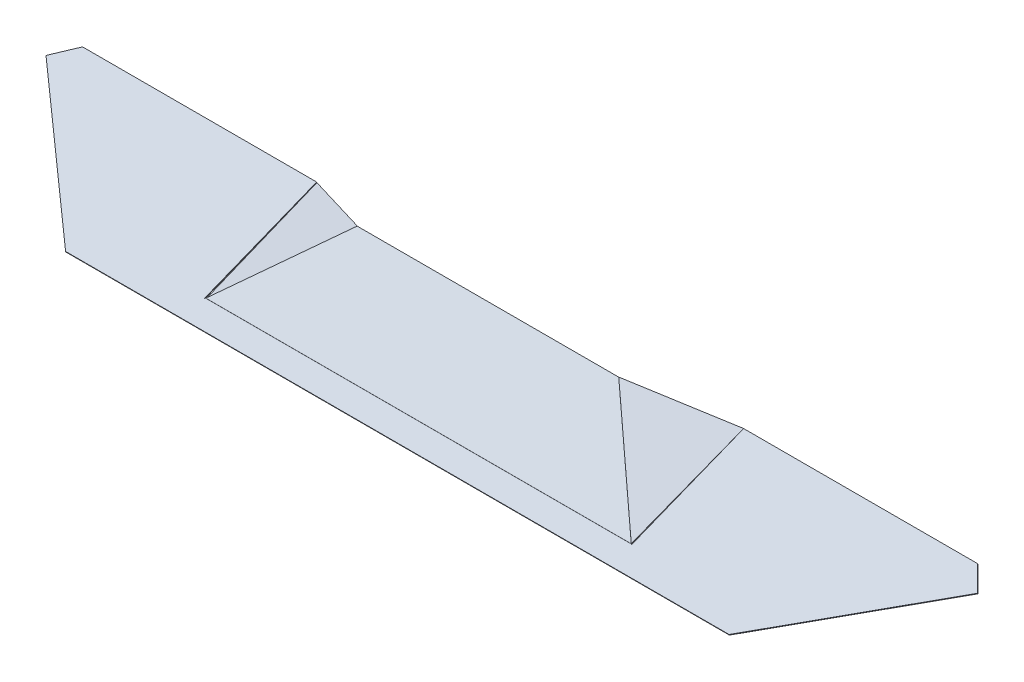
ISO-10303-21;
HEADER;
FILE_DESCRIPTION(('STEP AP214'),'2;1');
FILE_NAME('part.step','',(''),(''),'','','');
FILE_SCHEMA(('AUTOMOTIVE_DESIGN { 1 0 10303 214 1 1 1 1 }'));
ENDSEC;
DATA;
#1=APPLICATION_CONTEXT('core data for automotive mechanical design processes');
#2=APPLICATION_PROTOCOL_DEFINITION('international standard','automotive_design',2000,#1);
#3=PRODUCT_CONTEXT('',#1,'mechanical');
#4=PRODUCT('Part','Part','',(#3));
#5=PRODUCT_RELATED_PRODUCT_CATEGORY('part','',(#4));
#6=PRODUCT_DEFINITION_FORMATION('','',#4);
#7=PRODUCT_DEFINITION_CONTEXT('part definition',#1,'design');
#8=PRODUCT_DEFINITION('design','',#6,#7);
#9=PRODUCT_DEFINITION_SHAPE('','',#8);
#10=(LENGTH_UNIT() NAMED_UNIT(*) SI_UNIT(.MILLI.,.METRE.));
#11=(NAMED_UNIT(*) PLANE_ANGLE_UNIT() SI_UNIT($,.RADIAN.));
#12=(NAMED_UNIT(*) SI_UNIT($,.STERADIAN.) SOLID_ANGLE_UNIT());
#13=UNCERTAINTY_MEASURE_WITH_UNIT(LENGTH_MEASURE(1.E-05),#10,'distance_accuracy_value','');
#14=(GEOMETRIC_REPRESENTATION_CONTEXT(3) GLOBAL_UNCERTAINTY_ASSIGNED_CONTEXT((#13)) GLOBAL_UNIT_ASSIGNED_CONTEXT((#10,
#11,#12)) REPRESENTATION_CONTEXT('',''));
#15=CARTESIAN_POINT('',(0.,0.,0.));
#16=DIRECTION('',(0.,0.,1.));
#17=DIRECTION('',(1.,0.,0.));
#18=AXIS2_PLACEMENT_3D('',#15,#16,#17);
#19=CARTESIAN_POINT('',(288.887807011262,234.001150955132,848.716663011759));
#20=DIRECTION('',(0.285010061459043,-0.475706194203848,0.832149554865712));
#21=DIRECTION('',(0.,-0.868156769319889,-0.496290060230962));
#22=AXIS2_PLACEMENT_3D('',#19,#20,#21);
#23=PLANE('',#22);
#24=DIRECTION('',(-0.861519930817182,0.253434956762582,0.439947873611757));
#25=VECTOR('',#24,1.);
#26=CARTESIAN_POINT('',(288.467625296201,233.158847957698,848.379064156842));
#27=LINE('',#26,#25);
#28=CARTESIAN_POINT('',(288.467625296201,233.158847957698,848.379064156842));
#29=VERTEX_POINT('',#28);
#30=CARTESIAN_POINT('',(176.61181804443,266.063683540094,905.499883758619));
#31=VERTEX_POINT('',#30);
#32=EDGE_CURVE('E125',#29,#31,#27,.T.);
#33=ORIENTED_EDGE('',*,*,#32,.T.);
#34=DIRECTION('',(-0.420181715061318,-0.842302997434319,-0.337598854917031));
#35=VECTOR('',#34,1.);
#36=CARTESIAN_POINT('',(177.031999759491,266.905986537528,905.837482613536));
#37=LINE('',#36,#35);
#38=CARTESIAN_POINT('',(177.031999759491,266.905986537528,905.837482613536));
#39=VERTEX_POINT('',#38);
#40=EDGE_CURVE('E13',#39,#31,#37,.T.);
#41=ORIENTED_EDGE('',*,*,#40,.F.);
#42=DIRECTION('',(-0.861519930817182,0.253434956762582,0.439947873611757));
#43=VECTOR('',#42,1.);
#44=CARTESIAN_POINT('',(288.887807011262,234.001150955132,848.716663011759));
#45=LINE('',#44,#43);
#46=CARTESIAN_POINT('',(288.887807011262,234.001150955132,848.716663011759));
#47=VERTEX_POINT('',#46);
#48=EDGE_CURVE('E118',#47,#39,#45,.T.);
#49=ORIENTED_EDGE('',*,*,#48,.F.);
#50=DIRECTION('',(-0.420181715061318,-0.842302997434319,-0.337598854917031));
#51=VECTOR('',#50,1.);
#52=CARTESIAN_POINT('',(288.887807011262,234.001150955132,848.716663011759));
#53=LINE('',#52,#51);
#54=EDGE_CURVE('E126',#47,#29,#53,.T.);
#55=ORIENTED_EDGE('',*,*,#54,.T.);
#56=EDGE_LOOP('',(#33,#41,#49,#55));
#57=FACE_BOUND('',#56,.T.);
#58=ADVANCED_FACE('F78',(#57),#23,.F.);
#59=CARTESIAN_POINT('',(177.031999759491,266.905986537528,905.837482613536));
#60=DIRECTION('',(0.640524328313609,-0.0117678602008179,-0.767847707755056));
#61=DIRECTION('',(-0.767900880025728,0.,-0.640568683636433));
#62=AXIS2_PLACEMENT_3D('',#59,#60,#61);
#63=PLANE('',#62);
#64=DIRECTION('',(0.642787609686535,-0.538875846535596,0.544460201349938));
#65=VECTOR('',#64,1.);
#66=CARTESIAN_POINT('',(176.61181804443,266.063683540094,905.499883758619));
#67=LINE('',#66,#65);
#68=CARTESIAN_POINT('',(287.366006523577,173.213796307251,999.311971687806));
#69=VERTEX_POINT('',#68);
#70=EDGE_CURVE('E106',#31,#69,#67,.T.);
#71=ORIENTED_EDGE('',*,*,#70,.T.);
#72=DIRECTION('',(-0.420181715061318,-0.842302997434319,-0.337598854917031));
#73=VECTOR('',#72,1.);
#74=CARTESIAN_POINT('',(287.786188238638,174.056099304685,999.649570542723));
#75=LINE('',#74,#73);
#76=CARTESIAN_POINT('',(287.786188238638,174.056099304685,999.649570542723));
#77=VERTEX_POINT('',#76);
#78=EDGE_CURVE('E86',#77,#69,#75,.T.);
#79=ORIENTED_EDGE('',*,*,#78,.F.);
#80=DIRECTION('',(0.642787609686535,-0.538875846535596,0.544460201349938));
#81=VECTOR('',#80,1.);
#82=CARTESIAN_POINT('',(177.031999759491,266.905986537528,905.837482613536));
#83=LINE('',#82,#81);
#84=EDGE_CURVE('E114',#39,#77,#83,.T.);
#85=ORIENTED_EDGE('',*,*,#84,.F.);
#86=ORIENTED_EDGE('',*,*,#40,.T.);
#87=EDGE_LOOP('',(#71,#79,#85,#86));
#88=FACE_BOUND('',#87,.T.);
#89=ADVANCED_FACE('F115',(#88),#63,.F.);
#90=CARTESIAN_POINT('',(287.786188238638,174.056099304685,999.649570542723));
#91=DIRECTION('',(-0.907414632383294,0.392790713074043,0.149379184157221));
#92=DIRECTION('',(-0.397247839672572,-0.917711367411058,0.));
#93=AXIS2_PLACEMENT_3D('',#90,#91,#92);
#94=PLANE('',#93);
#95=DIRECTION('',(0.00678316038592086,0.3691085426212,-0.929361540251819));
#96=VECTOR('',#95,1.);
#97=CARTESIAN_POINT('',(287.366006523577,173.213796307251,999.311971687806));
#98=LINE('',#97,#96);
#99=EDGE_CURVE('E111',#69,#29,#98,.T.);
#100=ORIENTED_EDGE('',*,*,#99,.T.);
#101=ORIENTED_EDGE('',*,*,#54,.F.);
#102=DIRECTION('',(0.00678316038592086,0.3691085426212,-0.929361540251819));
#103=VECTOR('',#102,1.);
#104=CARTESIAN_POINT('',(287.786188238638,174.056099304685,999.649570542723));
#105=LINE('',#104,#103);
#106=EDGE_CURVE('E94',#77,#47,#105,.T.);
#107=ORIENTED_EDGE('',*,*,#106,.F.);
#108=ORIENTED_EDGE('',*,*,#78,.T.);
#109=EDGE_LOOP('',(#100,#101,#107,#108));
#110=FACE_BOUND('',#109,.T.);
#111=ADVANCED_FACE('F133',(#110),#94,.F.);
#112=CARTESIAN_POINT('',(254.214567445107,509.602594485186,204.251027106623));
#113=DIRECTION('',(-0.420181715061318,-0.842302997434319,-0.337598854917031));
#114=DIRECTION('',(0.894838919549624,-0.446389189003565,0.));
#115=AXIS2_PLACEMENT_3D('',#112,#113,#114);
#116=PLANE('',#115);
#117=ORIENTED_EDGE('',*,*,#48,.T.);
#118=ORIENTED_EDGE('',*,*,#84,.T.);
#119=ORIENTED_EDGE('',*,*,#106,.T.);
#120=EDGE_LOOP('',(#117,#118,#119));
#121=FACE_BOUND('',#120,.T.);
#122=ADVANCED_FACE('F121',(#121),#116,.F.);
#123=CARTESIAN_POINT('',(253.794385730046,508.760291487751,203.913428251706));
#124=DIRECTION('',(-0.420181715061318,-0.842302997434319,-0.337598854917031));
#125=DIRECTION('',(0.894838919549624,-0.446389189003565,0.));
#126=AXIS2_PLACEMENT_3D('',#123,#124,#125);
#127=PLANE('',#126);
#128=ORIENTED_EDGE('',*,*,#32,.F.);
#129=ORIENTED_EDGE('',*,*,#99,.F.);
#130=ORIENTED_EDGE('',*,*,#70,.F.);
#131=EDGE_LOOP('',(#128,#129,#130));
#132=FACE_BOUND('',#131,.T.);
#133=ADVANCED_FACE('F134',(#132),#127,.T.);
#134=CLOSED_SHELL('',(#58,#89,#111,#122,#133));
#135=MANIFOLD_SOLID_BREP('B2',#134);
#136=CARTESIAN_POINT('',(-288.428732188603,232.151779687274,847.977992877797));
#137=DIRECTION('',(0.907413105657838,0.392872566416373,0.149173061367698));
#138=DIRECTION('',(-0.397318117843622,0.917680943047856,0.));
#139=AXIS2_PLACEMENT_3D('',#136,#137,#138);
#140=PLANE('',#139);
#141=DIRECTION('',(-0.00698441182401754,0.36902141817322,-0.929394647564154));
#142=VECTOR('',#141,1.);
#143=CARTESIAN_POINT('',(-288.848913903664,232.994082684708,848.315591732714));
#144=LINE('',#143,#142);
#145=CARTESIAN_POINT('',(-287.717339417154,173.207341538567,998.890800867172));
#146=VERTEX_POINT('',#145);
#147=CARTESIAN_POINT('',(-288.848913903664,232.994082684708,848.315591732714));
#148=VERTEX_POINT('',#147);
#149=EDGE_CURVE('E232',#146,#148,#144,.T.);
#150=ORIENTED_EDGE('',*,*,#149,.T.);
#151=DIRECTION('',(-0.420181715061318,0.842302997434319,0.337598854917032));
#152=VECTOR('',#151,1.);
#153=CARTESIAN_POINT('',(-288.428732188603,232.151779687274,847.977992877797));
#154=LINE('',#153,#152);
#155=CARTESIAN_POINT('',(-288.428732188603,232.151779687274,847.977992877797));
#156=VERTEX_POINT('',#155);
#157=EDGE_CURVE('E76',#156,#148,#154,.T.);
#158=ORIENTED_EDGE('',*,*,#157,.F.);
#159=DIRECTION('',(-0.00698441182401754,0.36902141817322,-0.929394647564154));
#160=VECTOR('',#159,1.);
#161=CARTESIAN_POINT('',(-288.428732188603,232.151779687274,847.977992877797));
#162=LINE('',#161,#160);
#163=CARTESIAN_POINT('',(-287.297157702093,172.365038541133,998.553202012255));
#164=VERTEX_POINT('',#163);
#165=EDGE_CURVE('E225',#164,#156,#162,.T.);
#166=ORIENTED_EDGE('',*,*,#165,.F.);
#167=DIRECTION('',(-0.420181715061318,0.842302997434319,0.337598854917032));
#168=VECTOR('',#167,1.);
#169=CARTESIAN_POINT('',(-287.297157702093,172.365038541133,998.553202012255));
#170=LINE('',#169,#168);
#171=EDGE_CURVE('E233',#164,#146,#170,.T.);
#172=ORIENTED_EDGE('',*,*,#171,.T.);
#173=EDGE_LOOP('',(#150,#158,#166,#172));
#174=FACE_BOUND('',#173,.T.);
#175=ADVANCED_FACE('F185',(#174),#140,.F.);
#176=CARTESIAN_POINT('',(-288.428732188603,232.151779687274,847.977992877797));
#177=DIRECTION('',(-0.282475585171227,-0.474958928428571,0.833439595944515));
#178=DIRECTION('',(0.,-0.86882285119073,-0.49512306879079));
#179=AXIS2_PLACEMENT_3D('',#176,#177,#178);
#180=PLANE('',#179);
#181=DIRECTION('',(0.862354260214619,0.254832644728153,0.43749908922254));
#182=VECTOR('',#181,1.);
#183=CARTESIAN_POINT('',(-288.848913903664,232.994082684708,848.315591732714));
#184=LINE('',#183,#182);
#185=CARTESIAN_POINT('',(-176.963150938007,266.05722877141,905.078712937985));
#186=VERTEX_POINT('',#185);
#187=EDGE_CURVE('E213',#148,#186,#184,.T.);
#188=ORIENTED_EDGE('',*,*,#187,.T.);
#189=DIRECTION('',(-0.420181715061318,0.842302997434319,0.337598854917032));
#190=VECTOR('',#189,1.);
#191=CARTESIAN_POINT('',(-176.542969222945,265.214925773976,904.741114083068));
#192=LINE('',#191,#190);
#193=CARTESIAN_POINT('',(-176.542969222945,265.214925773976,904.741114083068));
#194=VERTEX_POINT('',#193);
#195=EDGE_CURVE('E193',#194,#186,#192,.T.);
#196=ORIENTED_EDGE('',*,*,#195,.F.);
#197=DIRECTION('',(0.862354260214619,0.254832644728153,0.43749908922254));
#198=VECTOR('',#197,1.);
#199=CARTESIAN_POINT('',(-288.428732188603,232.151779687274,847.977992877797));
#200=LINE('',#199,#198);
#201=EDGE_CURVE('E221',#156,#194,#200,.T.);
#202=ORIENTED_EDGE('',*,*,#201,.F.);
#203=ORIENTED_EDGE('',*,*,#157,.T.);
#204=EDGE_LOOP('',(#188,#196,#202,#203));
#205=FACE_BOUND('',#204,.T.);
#206=ADVANCED_FACE('F222',(#205),#180,.F.);
#207=CARTESIAN_POINT('',(-176.542969222945,265.214925773976,904.741114083068));
#208=DIRECTION('',(-0.640524328313609,-0.0117678602008171,-0.767847707755057));
#209=DIRECTION('',(-0.767900880025728,0.,0.640568683636433));
#210=AXIS2_PLACEMENT_3D('',#207,#208,#209);
#211=PLANE('',#210);
#212=DIRECTION('',(-0.642787609686535,-0.538875846535596,0.544460201349938));
#213=VECTOR('',#212,1.);
#214=CARTESIAN_POINT('',(-176.963150938007,266.05722877141,905.078712937985));
#215=LINE('',#214,#213);
#216=EDGE_CURVE('E218',#186,#146,#215,.T.);
#217=ORIENTED_EDGE('',*,*,#216,.T.);
#218=ORIENTED_EDGE('',*,*,#171,.F.);
#219=DIRECTION('',(-0.642787609686535,-0.538875846535596,0.544460201349938));
#220=VECTOR('',#219,1.);
#221=CARTESIAN_POINT('',(-176.542969222945,265.214925773976,904.741114083068));
#222=LINE('',#221,#220);
#223=EDGE_CURVE('E201',#194,#164,#222,.T.);
#224=ORIENTED_EDGE('',*,*,#223,.F.);
#225=ORIENTED_EDGE('',*,*,#195,.T.);
#226=EDGE_LOOP('',(#217,#218,#224,#225));
#227=FACE_BOUND('',#226,.T.);
#228=ADVANCED_FACE('F240',(#227),#211,.F.);
#229=CARTESIAN_POINT('',(-253.374204014985,507.917988490318,203.57582939679));
#230=DIRECTION('',(-0.420181715061318,0.842302997434319,0.337598854917032));
#231=DIRECTION('',(-0.894838919549625,-0.446389189003565,0.));
#232=AXIS2_PLACEMENT_3D('',#229,#230,#231);
#233=PLANE('',#232);
#234=ORIENTED_EDGE('',*,*,#165,.T.);
#235=ORIENTED_EDGE('',*,*,#201,.T.);
#236=ORIENTED_EDGE('',*,*,#223,.T.);
#237=EDGE_LOOP('',(#234,#235,#236));
#238=FACE_BOUND('',#237,.T.);
#239=ADVANCED_FACE('F228',(#238),#233,.F.);
#240=CARTESIAN_POINT('',(-253.794385730046,508.760291487752,203.913428251707));
#241=DIRECTION('',(-0.420181715061318,0.842302997434319,0.337598854917032));
#242=DIRECTION('',(-0.894838919549625,-0.446389189003565,0.));
#243=AXIS2_PLACEMENT_3D('',#240,#241,#242);
#244=PLANE('',#243);
#245=ORIENTED_EDGE('',*,*,#149,.F.);
#246=ORIENTED_EDGE('',*,*,#216,.F.);
#247=ORIENTED_EDGE('',*,*,#187,.F.);
#248=EDGE_LOOP('',(#245,#246,#247));
#249=FACE_BOUND('',#248,.T.);
#250=ADVANCED_FACE('F241',(#249),#244,.T.);
#251=CLOSED_SHELL('',(#175,#206,#228,#239,#250));
#252=MANIFOLD_SOLID_BREP('B7',#251);
#253=CARTESIAN_POINT('',(-288.848913903664,172.587219436625,1000.07543952209));
#254=DIRECTION('',(-0.766044443118982,0.237717163190301,-0.597215590462342));
#255=DIRECTION('',(-0.512210129832261,0.335583401456135,0.790584950251615));
#256=AXIS2_PLACEMENT_3D('',#253,#254,#255);
#257=PLANE('',#256);
#258=DIRECTION('',(-0.642787609686534,-0.283300283253349,0.711733825486778));
#259=VECTOR('',#258,1.);
#260=CARTESIAN_POINT('',(-288.848913903664,173.51632196048,1000.44526177692));
#261=LINE('',#260,#259);
#262=CARTESIAN_POINT('',(-288.30228912782,173.757239724755,999.840005333024));
#263=VERTEX_POINT('',#262);
#264=CARTESIAN_POINT('',(-288.848913903664,173.51632196048,1000.44526177692));
#265=VERTEX_POINT('',#264);
#266=EDGE_CURVE('E310',#263,#265,#261,.T.);
#267=ORIENTED_EDGE('',*,*,#266,.F.);
#268=CARTESIAN_POINT('',(-288.30228912782,172.828137200901,999.470183078195));
#269=CARTESIAN_POINT('',(-288.30228912782,173.757239724755,999.840005333024));
#270=B_SPLINE_CURVE_WITH_KNOTS('',1,(#268,#269),.UNSPECIFIED.,.F.,.F.,(2,2),(0.,1.),.UNSPECIFIED.);
#271=CARTESIAN_POINT('',(-288.30228912782,172.828137200901,999.470183078195));
#272=VERTEX_POINT('',#271);
#273=EDGE_CURVE('E399',#263,#272,#270,.F.);
#274=ORIENTED_EDGE('',*,*,#273,.T.);
#275=DIRECTION('',(-0.642787609686534,-0.283300283253349,0.711733825486778));
#276=VECTOR('',#275,1.);
#277=CARTESIAN_POINT('',(-288.848913903664,172.587219436625,1000.07543952209));
#278=LINE('',#277,#276);
#279=CARTESIAN_POINT('',(-288.848913903664,172.587219436625,1000.07543952209));
#280=VERTEX_POINT('',#279);
#281=EDGE_CURVE('E401',#272,#280,#278,.T.);
#282=ORIENTED_EDGE('',*,*,#281,.T.);
#283=DIRECTION('',(0.,0.929102523854783,0.36982225482882));
#284=VECTOR('',#283,1.);
#285=CARTESIAN_POINT('',(-288.848913903664,172.587219436625,1000.07543952209));
#286=LINE('',#285,#284);
#287=EDGE_CURVE('E676',#280,#265,#286,.T.);
#288=ORIENTED_EDGE('',*,*,#287,.T.);
#289=EDGE_LOOP('',(#267,#274,#282,#288));
#290=FACE_BOUND('',#289,.T.);
#291=ADVANCED_FACE('F283',(#290),#257,.T.);
#292=CARTESIAN_POINT('',(288.848913903664,172.587219436625,1000.07543952209));
#293=DIRECTION('',(0.766044443118982,0.237717163190302,-0.597215590462343));
#294=DIRECTION('',(-0.512210129832261,-0.335583401456135,-0.790584950251615));
#295=AXIS2_PLACEMENT_3D('',#292,#293,#294);
#296=PLANE('',#295);
#297=DIRECTION('',(-0.642787609686535,0.283300283253349,-0.711733825486777));
#298=VECTOR('',#297,1.);
#299=CARTESIAN_POINT('',(288.848913903664,172.587219436625,1000.07543952209));
#300=LINE('',#299,#298);
#301=CARTESIAN_POINT('',(288.848913903664,172.587219436625,1000.07543952209));
#302=VERTEX_POINT('',#301);
#303=CARTESIAN_POINT('',(288.30228912782,172.8281372009,999.470183078195));
#304=VERTEX_POINT('',#303);
#305=EDGE_CURVE('E421',#302,#304,#300,.T.);
#306=ORIENTED_EDGE('',*,*,#305,.T.);
#307=CARTESIAN_POINT('',(288.30228912782,173.757239724755,999.840005333024));
#308=CARTESIAN_POINT('',(288.30228912782,172.8281372009,999.470183078195));
#309=B_SPLINE_CURVE_WITH_KNOTS('',1,(#307,#308),.UNSPECIFIED.,.F.,.F.,(2,2),(0.,1.),.UNSPECIFIED.);
#310=CARTESIAN_POINT('',(288.30228912782,173.757239724756,999.840005333024));
#311=VERTEX_POINT('',#310);
#312=EDGE_CURVE('E183',#304,#311,#309,.F.);
#313=ORIENTED_EDGE('',*,*,#312,.T.);
#314=DIRECTION('',(-0.642787609686535,0.283300283253349,-0.711733825486777));
#315=VECTOR('',#314,1.);
#316=CARTESIAN_POINT('',(288.848913903664,173.51632196048,1000.44526177692));
#317=LINE('',#316,#315);
#318=CARTESIAN_POINT('',(288.848913903664,173.51632196048,1000.44526177692));
#319=VERTEX_POINT('',#318);
#320=EDGE_CURVE('E303',#319,#311,#317,.T.);
#321=ORIENTED_EDGE('',*,*,#320,.F.);
#322=DIRECTION('',(0.,0.929102523854783,0.36982225482882));
#323=VECTOR('',#322,1.);
#324=CARTESIAN_POINT('',(288.848913903664,172.587219436625,1000.07543952209));
#325=LINE('',#324,#323);
#326=EDGE_CURVE('E679',#302,#319,#325,.T.);
#327=ORIENTED_EDGE('',*,*,#326,.F.);
#328=EDGE_LOOP('',(#306,#313,#321,#327));
#329=FACE_BOUND('',#328,.T.);
#330=ADVANCED_FACE('F285',(#329),#296,.T.);
#331=CARTESIAN_POINT('',(4.47895829043596E-13,391.511522191619,452.77705609597));
#332=DIRECTION('',(0.,0.929102523854783,0.369822254828819));
#333=DIRECTION('',(0.,-0.369822254828819,0.929102523854783));
#334=AXIS2_PLACEMENT_3D('',#331,#332,#333);
#335=PLANE('',#334);
#336=ORIENTED_EDGE('',*,*,#320,.T.);
#337=DIRECTION('',(-1.,0.,0.));
#338=VECTOR('',#337,1.);
#339=CARTESIAN_POINT('',(5.9871513001089E-13,173.757239724755,999.840005333024));
#340=LINE('',#339,#338);
#341=EDGE_CURVE('E296',#311,#263,#340,.T.);
#342=ORIENTED_EDGE('',*,*,#341,.T.);
#343=ORIENTED_EDGE('',*,*,#266,.T.);
#344=DIRECTION('',(0.,0.36982225482882,-0.929102523854783));
#345=VECTOR('',#344,1.);
#346=CARTESIAN_POINT('',(-288.848913903664,233.923185208563,848.685413987543));
#347=LINE('',#346,#345);
#348=CARTESIAN_POINT('',(-288.848913903664,233.923185208563,848.685413987543));
#349=VERTEX_POINT('',#348);
#350=EDGE_CURVE('E664',#265,#349,#347,.T.);
#351=ORIENTED_EDGE('',*,*,#350,.T.);
#352=DIRECTION('',(-1.,0.,0.));
#353=VECTOR('',#352,1.);
#354=CARTESIAN_POINT('',(-288.848913903664,233.923185208563,848.685413987543));
#355=LINE('',#354,#353);
#356=CARTESIAN_POINT('',(-605.56328041433,233.923185208563,848.685413987542));
#357=VERTEX_POINT('',#356);
#358=EDGE_CURVE('E607',#349,#357,#355,.T.);
#359=ORIENTED_EDGE('',*,*,#358,.T.);
#360=DIRECTION('',(-0.676587289763094,-0.272323216999984,0.684156199134241));
#361=VECTOR('',#360,1.);
#362=CARTESIAN_POINT('',(-605.56328041433,233.923185208563,848.685413987542));
#363=LINE('',#362,#361);
#364=CARTESIAN_POINT('',(-630.148809346447,224.027624899139,873.545978592283));
#365=VERTEX_POINT('',#364);
#366=EDGE_CURVE('E530',#357,#365,#363,.T.);
#367=ORIENTED_EDGE('',*,*,#366,.T.);
#368=DIRECTION('',(0.736362437479686,-0.250217037088709,0.628618958526963));
#369=VECTOR('',#368,1.);
#370=CARTESIAN_POINT('',(-630.148809346447,224.027624899139,873.545978592283));
#371=LINE('',#370,#369);
#372=CARTESIAN_POINT('',(-448.848913903664,162.421654315615,1028.31833749256));
#373=VERTEX_POINT('',#372);
#374=EDGE_CURVE('E641',#365,#373,#371,.T.);
#375=ORIENTED_EDGE('',*,*,#374,.T.);
#376=DIRECTION('',(1.,0.,0.));
#377=VECTOR('',#376,1.);
#378=CARTESIAN_POINT('',(-448.848913903664,162.421654315615,1028.31833749256));
#379=LINE('',#378,#377);
#380=CARTESIAN_POINT('',(448.848913903664,162.421654315615,1028.31833749256));
#381=VERTEX_POINT('',#380);
#382=EDGE_CURVE('E645',#373,#381,#379,.T.);
#383=ORIENTED_EDGE('',*,*,#382,.T.);
#384=DIRECTION('',(0.736362437479686,0.250217037088709,-0.628618958526963));
#385=VECTOR('',#384,1.);
#386=CARTESIAN_POINT('',(448.848913903664,162.421654315615,1028.31833749256));
#387=LINE('',#386,#385);
#388=CARTESIAN_POINT('',(630.148809346446,224.027624899139,873.545978592283));
#389=VERTEX_POINT('',#388);
#390=EDGE_CURVE('E649',#381,#389,#387,.T.);
#391=ORIENTED_EDGE('',*,*,#390,.T.);
#392=DIRECTION('',(-0.676587289763097,0.272323216999984,-0.684156199134238));
#393=VECTOR('',#392,1.);
#394=CARTESIAN_POINT('',(630.148809346446,224.027624899139,873.545978592283));
#395=LINE('',#394,#393);
#396=CARTESIAN_POINT('',(605.56328041433,233.923185208563,848.685413987542));
#397=VERTEX_POINT('',#396);
#398=EDGE_CURVE('E653',#389,#397,#395,.T.);
#399=ORIENTED_EDGE('',*,*,#398,.T.);
#400=DIRECTION('',(-1.,0.,0.));
#401=VECTOR('',#400,1.);
#402=CARTESIAN_POINT('',(605.56328041433,233.923185208563,848.685413987542));
#403=LINE('',#402,#401);
#404=CARTESIAN_POINT('',(288.848913903664,233.923185208563,848.685413987543));
#405=VERTEX_POINT('',#404);
#406=EDGE_CURVE('E657',#397,#405,#403,.T.);
#407=ORIENTED_EDGE('',*,*,#406,.T.);
#408=DIRECTION('',(0.,-0.36982225482882,0.929102523854783));
#409=VECTOR('',#408,1.);
#410=CARTESIAN_POINT('',(288.848913903664,233.923185208563,848.685413987543));
#411=LINE('',#410,#409);
#412=EDGE_CURVE('E661',#405,#319,#411,.T.);
#413=ORIENTED_EDGE('',*,*,#412,.T.);
#414=EDGE_LOOP('',(#336,#342,#343,#351,#359,#367,#375,#383,#391,#399,#407,#413));
#415=FACE_BOUND('',#414,.T.);
#416=ADVANCED_FACE('F728',(#415),#335,.T.);
#417=CARTESIAN_POINT('',(-605.56328041433,232.994082684708,848.315591732714));
#418=DIRECTION('',(-0.73636243747969,0.250217037088707,-0.628618958526958));
#419=DIRECTION('',(-0.546780501103968,0.327149792472144,0.77071661257425));
#420=AXIS2_PLACEMENT_3D('',#417,#418,#419);
#421=PLANE('',#420);
#422=ORIENTED_EDGE('',*,*,#366,.F.);
#423=DIRECTION('',(0.,0.929102523854783,0.36982225482882));
#424=VECTOR('',#423,1.);
#425=CARTESIAN_POINT('',(-605.56328041433,232.994082684708,848.315591732714));
#426=LINE('',#425,#424);
#427=CARTESIAN_POINT('',(-605.56328041433,232.994082684708,848.315591732714));
#428=VERTEX_POINT('',#427);
#429=EDGE_CURVE('E434',#428,#357,#426,.T.);
#430=ORIENTED_EDGE('',*,*,#429,.F.);
#431=DIRECTION('',(-0.676587289763094,-0.272323216999984,0.684156199134241));
#432=VECTOR('',#431,1.);
#433=CARTESIAN_POINT('',(-605.56328041433,232.994082684708,848.315591732714));
#434=LINE('',#433,#432);
#435=CARTESIAN_POINT('',(-630.148809346447,223.098522375284,873.176156337454));
#436=VERTEX_POINT('',#435);
#437=EDGE_CURVE('E602',#428,#436,#434,.T.);
#438=ORIENTED_EDGE('',*,*,#437,.T.);
#439=DIRECTION('',(0.,0.929102523854783,0.36982225482882));
#440=VECTOR('',#439,1.);
#441=CARTESIAN_POINT('',(-630.148809346447,223.098522375284,873.176156337454));
#442=LINE('',#441,#440);
#443=EDGE_CURVE('E637',#436,#365,#442,.T.);
#444=ORIENTED_EDGE('',*,*,#443,.T.);
#445=EDGE_LOOP('',(#422,#430,#438,#444));
#446=FACE_BOUND('',#445,.T.);
#447=ADVANCED_FACE('F737',(#446),#421,.T.);
#448=CARTESIAN_POINT('',(-288.848913903664,232.994082684708,848.315591732714));
#449=DIRECTION('',(0.,0.36982225482882,-0.929102523854783));
#450=DIRECTION('',(0.,0.929102523854783,0.36982225482882));
#451=AXIS2_PLACEMENT_3D('',#448,#449,#450);
#452=PLANE('',#451);
#453=ORIENTED_EDGE('',*,*,#358,.F.);
#454=DIRECTION('',(0.,0.929102523854783,0.36982225482882));
#455=VECTOR('',#454,1.);
#456=CARTESIAN_POINT('',(-288.848913903664,232.994082684708,848.315591732714));
#457=LINE('',#456,#455);
#458=CARTESIAN_POINT('',(-288.848913903664,232.994082684708,848.315591732714));
#459=VERTEX_POINT('',#458);
#460=EDGE_CURVE('E673',#459,#349,#457,.T.);
#461=ORIENTED_EDGE('',*,*,#460,.F.);
#462=DIRECTION('',(-1.,0.,0.));
#463=VECTOR('',#462,1.);
#464=CARTESIAN_POINT('',(-288.848913903664,232.994082684708,848.315591732714));
#465=LINE('',#464,#463);
#466=EDGE_CURVE('E633',#459,#428,#465,.T.);
#467=ORIENTED_EDGE('',*,*,#466,.T.);
#468=ORIENTED_EDGE('',*,*,#429,.T.);
#469=EDGE_LOOP('',(#453,#461,#467,#468));
#470=FACE_BOUND('',#469,.T.);
#471=ADVANCED_FACE('F585',(#470),#452,.T.);
#472=CARTESIAN_POINT('',(-288.848913903664,232.994082684708,848.315591732714));
#473=DIRECTION('',(1.,0.,0.));
#474=DIRECTION('',(0.,-0.390731128489275,-0.92050485345244));
#475=AXIS2_PLACEMENT_3D('',#472,#473,#474);
#476=PLANE('',#475);
#477=ORIENTED_EDGE('',*,*,#350,.F.);
#478=ORIENTED_EDGE('',*,*,#287,.F.);
#479=DIRECTION('',(0.,0.36982225482882,-0.929102523854783));
#480=VECTOR('',#479,1.);
#481=CARTESIAN_POINT('',(-288.848913903664,232.994082684708,848.315591732714));
#482=LINE('',#481,#480);
#483=EDGE_CURVE('E419',#280,#459,#482,.T.);
#484=ORIENTED_EDGE('',*,*,#483,.T.);
#485=ORIENTED_EDGE('',*,*,#460,.T.);
#486=EDGE_LOOP('',(#477,#478,#484,#485));
#487=FACE_BOUND('',#486,.T.);
#488=ADVANCED_FACE('F732',(#487),#476,.T.);
#489=CARTESIAN_POINT('',(288.848913903664,232.994082684708,848.315591732714));
#490=DIRECTION('',(-1.,0.,0.));
#491=DIRECTION('',(0.,0.390731128489275,0.92050485345244));
#492=AXIS2_PLACEMENT_3D('',#489,#490,#491);
#493=PLANE('',#492);
#494=ORIENTED_EDGE('',*,*,#412,.F.);
#495=DIRECTION('',(0.,0.929102523854783,0.36982225482882));
#496=VECTOR('',#495,1.);
#497=CARTESIAN_POINT('',(288.848913903664,232.994082684708,848.315591732714));
#498=LINE('',#497,#496);
#499=CARTESIAN_POINT('',(288.848913903664,232.994082684708,848.315591732714));
#500=VERTEX_POINT('',#499);
#501=EDGE_CURVE('E682',#500,#405,#498,.T.);
#502=ORIENTED_EDGE('',*,*,#501,.F.);
#503=DIRECTION('',(0.,-0.36982225482882,0.929102523854783));
#504=VECTOR('',#503,1.);
#505=CARTESIAN_POINT('',(288.848913903664,232.994082684708,848.315591732714));
#506=LINE('',#505,#504);
#507=EDGE_CURVE('E627',#500,#302,#506,.T.);
#508=ORIENTED_EDGE('',*,*,#507,.T.);
#509=ORIENTED_EDGE('',*,*,#326,.T.);
#510=EDGE_LOOP('',(#494,#502,#508,#509));
#511=FACE_BOUND('',#510,.T.);
#512=ADVANCED_FACE('F760',(#511),#493,.T.);
#513=CARTESIAN_POINT('',(605.56328041433,232.994082684708,848.315591732714));
#514=DIRECTION('',(0.,0.36982225482882,-0.929102523854783));
#515=DIRECTION('',(0.,0.929102523854783,0.36982225482882));
#516=AXIS2_PLACEMENT_3D('',#513,#514,#515);
#517=PLANE('',#516);
#518=ORIENTED_EDGE('',*,*,#406,.F.);
#519=DIRECTION('',(0.,0.929102523854783,0.36982225482882));
#520=VECTOR('',#519,1.);
#521=CARTESIAN_POINT('',(605.56328041433,232.994082684708,848.315591732714));
#522=LINE('',#521,#520);
#523=CARTESIAN_POINT('',(605.56328041433,232.994082684708,848.315591732714));
#524=VERTEX_POINT('',#523);
#525=EDGE_CURVE('E685',#524,#397,#522,.T.);
#526=ORIENTED_EDGE('',*,*,#525,.F.);
#527=DIRECTION('',(-1.,0.,0.));
#528=VECTOR('',#527,1.);
#529=CARTESIAN_POINT('',(605.56328041433,232.994082684708,848.315591732714));
#530=LINE('',#529,#528);
#531=EDGE_CURVE('E623',#524,#500,#530,.T.);
#532=ORIENTED_EDGE('',*,*,#531,.T.);
#533=ORIENTED_EDGE('',*,*,#501,.T.);
#534=EDGE_LOOP('',(#518,#526,#532,#533));
#535=FACE_BOUND('',#534,.T.);
#536=ADVANCED_FACE('F757',(#535),#517,.T.);
#537=CARTESIAN_POINT('',(630.148809346446,223.098522375285,873.176156337454));
#538=DIRECTION('',(0.736362437479688,0.250217037088709,-0.628618958526961));
#539=DIRECTION('',(-0.546780501103971,-0.327149792472144,-0.770716612574248));
#540=AXIS2_PLACEMENT_3D('',#537,#538,#539);
#541=PLANE('',#540);
#542=ORIENTED_EDGE('',*,*,#398,.F.);
#543=DIRECTION('',(0.,0.929102523854783,0.36982225482882));
#544=VECTOR('',#543,1.);
#545=CARTESIAN_POINT('',(630.148809346446,223.098522375285,873.176156337454));
#546=LINE('',#545,#544);
#547=CARTESIAN_POINT('',(630.148809346446,223.098522375285,873.176156337454));
#548=VERTEX_POINT('',#547);
#549=EDGE_CURVE('E688',#548,#389,#546,.T.);
#550=ORIENTED_EDGE('',*,*,#549,.F.);
#551=DIRECTION('',(-0.676587289763097,0.272323216999984,-0.684156199134238));
#552=VECTOR('',#551,1.);
#553=CARTESIAN_POINT('',(630.148809346446,223.098522375285,873.176156337454));
#554=LINE('',#553,#552);
#555=EDGE_CURVE('E619',#548,#524,#554,.T.);
#556=ORIENTED_EDGE('',*,*,#555,.T.);
#557=ORIENTED_EDGE('',*,*,#525,.T.);
#558=EDGE_LOOP('',(#542,#550,#556,#557));
#559=FACE_BOUND('',#558,.T.);
#560=ADVANCED_FACE('F753',(#559),#541,.T.);
#561=CARTESIAN_POINT('',(448.848913903664,161.49255179176,1027.94851523773));
#562=DIRECTION('',(0.676587289763099,-0.272323216999983,0.684156199134236));
#563=DIRECTION('',(0.611847450238069,-0.309058862360363,-0.728097052070458));
#564=AXIS2_PLACEMENT_3D('',#561,#562,#563);
#565=PLANE('',#564);
#566=ORIENTED_EDGE('',*,*,#390,.F.);
#567=DIRECTION('',(0.,0.929102523854783,0.36982225482882));
#568=VECTOR('',#567,1.);
#569=CARTESIAN_POINT('',(448.848913903664,161.49255179176,1027.94851523773));
#570=LINE('',#569,#568);
#571=CARTESIAN_POINT('',(448.848913903664,161.49255179176,1027.94851523773));
#572=VERTEX_POINT('',#571);
#573=EDGE_CURVE('E691',#572,#381,#570,.T.);
#574=ORIENTED_EDGE('',*,*,#573,.F.);
#575=DIRECTION('',(0.736362437479686,0.250217037088709,-0.628618958526963));
#576=VECTOR('',#575,1.);
#577=CARTESIAN_POINT('',(448.848913903664,161.49255179176,1027.94851523773));
#578=LINE('',#577,#576);
#579=EDGE_CURVE('E615',#572,#548,#578,.T.);
#580=ORIENTED_EDGE('',*,*,#579,.T.);
#581=ORIENTED_EDGE('',*,*,#549,.T.);
#582=EDGE_LOOP('',(#566,#574,#580,#581));
#583=FACE_BOUND('',#582,.T.);
#584=ADVANCED_FACE('F749',(#583),#565,.T.);
#585=CARTESIAN_POINT('',(-448.848913903664,161.49255179176,1027.94851523773));
#586=DIRECTION('',(0.,-0.36982225482882,0.929102523854783));
#587=DIRECTION('',(0.,-0.929102523854783,-0.36982225482882));
#588=AXIS2_PLACEMENT_3D('',#585,#586,#587);
#589=PLANE('',#588);
#590=ORIENTED_EDGE('',*,*,#382,.F.);
#591=DIRECTION('',(0.,0.929102523854783,0.36982225482882));
#592=VECTOR('',#591,1.);
#593=CARTESIAN_POINT('',(-448.848913903664,161.49255179176,1027.94851523773));
#594=LINE('',#593,#592);
#595=CARTESIAN_POINT('',(-448.848913903664,161.49255179176,1027.94851523773));
#596=VERTEX_POINT('',#595);
#597=EDGE_CURVE('E694',#596,#373,#594,.T.);
#598=ORIENTED_EDGE('',*,*,#597,.F.);
#599=DIRECTION('',(1.,0.,0.));
#600=VECTOR('',#599,1.);
#601=CARTESIAN_POINT('',(-448.848913903664,161.49255179176,1027.94851523773));
#602=LINE('',#601,#600);
#603=EDGE_CURVE('E611',#596,#572,#602,.T.);
#604=ORIENTED_EDGE('',*,*,#603,.T.);
#605=ORIENTED_EDGE('',*,*,#573,.T.);
#606=EDGE_LOOP('',(#590,#598,#604,#605));
#607=FACE_BOUND('',#606,.T.);
#608=ADVANCED_FACE('F745',(#607),#589,.T.);
#609=CARTESIAN_POINT('',(-630.148809346447,223.098522375284,873.176156337454));
#610=DIRECTION('',(-0.676587289763099,-0.272323216999983,0.684156199134236));
#611=DIRECTION('',(0.611847450238069,0.309058862360364,0.728097052070458));
#612=AXIS2_PLACEMENT_3D('',#609,#610,#611);
#613=PLANE('',#612);
#614=ORIENTED_EDGE('',*,*,#374,.F.);
#615=ORIENTED_EDGE('',*,*,#443,.F.);
#616=DIRECTION('',(0.736362437479686,-0.250217037088709,0.628618958526963));
#617=VECTOR('',#616,1.);
#618=CARTESIAN_POINT('',(-630.148809346447,223.098522375284,873.176156337454));
#619=LINE('',#618,#617);
#620=EDGE_CURVE('E606',#436,#596,#619,.T.);
#621=ORIENTED_EDGE('',*,*,#620,.T.);
#622=ORIENTED_EDGE('',*,*,#597,.T.);
#623=EDGE_LOOP('',(#614,#615,#621,#622));
#624=FACE_BOUND('',#623,.T.);
#625=ADVANCED_FACE('F741',(#624),#613,.T.);
#626=CARTESIAN_POINT('',(4.4796920996743E-13,390.582419667764,452.407233841141));
#627=DIRECTION('',(0.,0.929102523854783,0.369822254828819));
#628=DIRECTION('',(0.,-0.369822254828819,0.929102523854783));
#629=AXIS2_PLACEMENT_3D('',#626,#627,#628);
#630=PLANE('',#629);
#631=DIRECTION('',(-1.,0.,0.));
#632=VECTOR('',#631,1.);
#633=CARTESIAN_POINT('',(5.98788510934724E-13,172.8281372009,999.470183078195));
#634=LINE('',#633,#632);
#635=EDGE_CURVE('E409',#304,#272,#634,.T.);
#636=ORIENTED_EDGE('',*,*,#635,.F.);
#637=ORIENTED_EDGE('',*,*,#305,.F.);
#638=ORIENTED_EDGE('',*,*,#507,.F.);
#639=ORIENTED_EDGE('',*,*,#531,.F.);
#640=ORIENTED_EDGE('',*,*,#555,.F.);
#641=ORIENTED_EDGE('',*,*,#579,.F.);
#642=ORIENTED_EDGE('',*,*,#603,.F.);
#643=ORIENTED_EDGE('',*,*,#620,.F.);
#644=ORIENTED_EDGE('',*,*,#437,.F.);
#645=ORIENTED_EDGE('',*,*,#466,.F.);
#646=ORIENTED_EDGE('',*,*,#483,.F.);
#647=ORIENTED_EDGE('',*,*,#281,.F.);
#648=EDGE_LOOP('',(#636,#637,#638,#639,#640,#641,#642,#643,#644,#645,#646,#647));
#649=FACE_BOUND('',#648,.T.);
#650=ADVANCED_FACE('F414',(#649),#630,.F.);
#651=CARTESIAN_POINT('',(-176.963150938007,266.05722877141,905.078712937985));
#652=DIRECTION('',(0.,0.703452458112666,-0.710742315593526));
#653=DIRECTION('',(0.,0.710742315593526,0.703452458112666));
#654=AXIS2_PLACEMENT_3D('',#651,#652,#653);
#655=PLANE('',#654);
#656=DIRECTION('',(-1.,0.,0.));
#657=VECTOR('',#656,1.);
#658=CARTESIAN_POINT('',(-176.963150938007,266.767971087004,905.782165396098));
#659=LINE('',#658,#657);
#660=CARTESIAN_POINT('',(176.963150938006,266.767971087004,905.782165396098));
#661=VERTEX_POINT('',#660);
#662=CARTESIAN_POINT('',(-176.963150938007,266.767971087004,905.782165396098));
#663=VERTEX_POINT('',#662);
#664=EDGE_CURVE('E532',#661,#663,#659,.T.);
#665=ORIENTED_EDGE('',*,*,#664,.F.);
#666=DIRECTION('',(0.,0.710742315593526,0.703452458112666));
#667=VECTOR('',#666,1.);
#668=CARTESIAN_POINT('',(176.963150938006,266.05722877141,905.078712937985));
#669=LINE('',#668,#667);
#670=CARTESIAN_POINT('',(176.963150938006,266.05722877141,905.078712937985));
#671=VERTEX_POINT('',#670);
#672=EDGE_CURVE('E521',#671,#661,#669,.T.);
#673=ORIENTED_EDGE('',*,*,#672,.F.);
#674=DIRECTION('',(-1.,0.,0.));
#675=VECTOR('',#674,1.);
#676=CARTESIAN_POINT('',(-176.963150938007,266.05722877141,905.078712937985));
#677=LINE('',#676,#675);
#678=CARTESIAN_POINT('',(-176.963150938007,266.05722877141,905.078712937985));
#679=VERTEX_POINT('',#678);
#680=EDGE_CURVE('E542',#671,#679,#677,.T.);
#681=ORIENTED_EDGE('',*,*,#680,.T.);
#682=DIRECTION('',(0.,0.710742315593526,0.703452458112666));
#683=VECTOR('',#682,1.);
#684=CARTESIAN_POINT('',(-176.963150938007,266.05722877141,905.078712937985));
#685=LINE('',#684,#683);
#686=EDGE_CURVE('E538',#679,#663,#685,.T.);
#687=ORIENTED_EDGE('',*,*,#686,.T.);
#688=EDGE_LOOP('',(#665,#673,#681,#687));
#689=FACE_BOUND('',#688,.T.);
#690=ADVANCED_FACE('F773',(#689),#655,.T.);
#691=CARTESIAN_POINT('',(6.19587863209666E-13,586.915351012502,580.895547254739));
#692=DIRECTION('',(0.,0.710742315593527,0.703452458112665));
#693=DIRECTION('',(0.,-0.703452458112665,0.710742315593527));
#694=AXIS2_PLACEMENT_3D('',#691,#692,#693);
#695=PLANE('',#694);
#696=DIRECTION('',(-0.642787609686535,0.538875846535596,-0.544460201349938));
#697=VECTOR('',#696,1.);
#698=CARTESIAN_POINT('',(288.848913903664,172.258695126989,999.849278074081));
#699=LINE('',#698,#697);
#700=CARTESIAN_POINT('',(287.717339417154,173.207341538567,998.890800867172));
#701=VERTEX_POINT('',#700);
#702=EDGE_CURVE('E531',#701,#671,#699,.T.);
#703=ORIENTED_EDGE('',*,*,#702,.F.);
#704=DIRECTION('',(-1.,0.,0.));
#705=VECTOR('',#704,1.);
#706=CARTESIAN_POINT('',(6.4036986348717E-13,173.207341538567,998.890800867172));
#707=LINE('',#706,#705);
#708=CARTESIAN_POINT('',(-287.717339417154,173.207341538567,998.890800867173));
#709=VERTEX_POINT('',#708);
#710=EDGE_CURVE('E541',#701,#709,#707,.T.);
#711=ORIENTED_EDGE('',*,*,#710,.T.);
#712=DIRECTION('',(-0.642787609686535,-0.538875846535596,0.544460201349938));
#713=VECTOR('',#712,1.);
#714=CARTESIAN_POINT('',(-288.848913903664,172.258695126989,999.849278074081));
#715=LINE('',#714,#713);
#716=EDGE_CURVE('E546',#679,#709,#715,.T.);
#717=ORIENTED_EDGE('',*,*,#716,.F.);
#718=ORIENTED_EDGE('',*,*,#680,.F.);
#719=EDGE_LOOP('',(#703,#711,#717,#718));
#720=FACE_BOUND('',#719,.T.);
#721=ADVANCED_FACE('F576',(#720),#695,.F.);
#722=CARTESIAN_POINT('',(-288.848913903664,172.258695126989,999.849278074081));
#723=DIRECTION('',(-0.766044443118982,0.452170524078358,-0.456856354143436));
#724=DIRECTION('',(-0.512210129832261,0.,0.858860164926292));
#725=AXIS2_PLACEMENT_3D('',#722,#723,#724);
#726=PLANE('',#725);
#727=CARTESIAN_POINT('',(-287.717339417154,173.918083854161,999.594253325285));
#728=CARTESIAN_POINT('',(-287.717339417154,173.207341538567,998.890800867173));
#729=B_SPLINE_CURVE_WITH_KNOTS('',1,(#727,#728),.UNSPECIFIED.,.F.,.F.,(2,2),(0.,1.),.UNSPECIFIED.);
#730=CARTESIAN_POINT('',(-287.717339417154,173.918083854161,999.594253325285));
#731=VERTEX_POINT('',#730);
#732=EDGE_CURVE('E440',#731,#709,#729,.T.);
#733=ORIENTED_EDGE('',*,*,#732,.F.);
#734=DIRECTION('',(-0.642787609686535,-0.538875846535596,0.544460201349938));
#735=VECTOR('',#734,1.);
#736=CARTESIAN_POINT('',(-288.848913903664,172.969437442582,1000.55273053219));
#737=LINE('',#736,#735);
#738=EDGE_CURVE('E536',#663,#731,#737,.T.);
#739=ORIENTED_EDGE('',*,*,#738,.F.);
#740=ORIENTED_EDGE('',*,*,#686,.F.);
#741=ORIENTED_EDGE('',*,*,#716,.T.);
#742=EDGE_LOOP('',(#733,#739,#740,#741));
#743=FACE_BOUND('',#742,.T.);
#744=ADVANCED_FACE('F565',(#743),#726,.T.);
#745=CARTESIAN_POINT('',(6.19587863209666E-13,587.626093328095,581.598999712851));
#746=DIRECTION('',(0.,0.710742315593527,0.703452458112665));
#747=DIRECTION('',(0.,-0.703452458112665,0.710742315593527));
#748=AXIS2_PLACEMENT_3D('',#745,#746,#747);
#749=PLANE('',#748);
#750=DIRECTION('',(-1.,0.,0.));
#751=VECTOR('',#750,1.);
#752=CARTESIAN_POINT('',(6.4036986348717E-13,173.91808385416,999.594253325285));
#753=LINE('',#752,#751);
#754=CARTESIAN_POINT('',(287.717339417154,173.918083854161,999.594253325285));
#755=VERTEX_POINT('',#754);
#756=EDGE_CURVE('E563',#755,#731,#753,.T.);
#757=ORIENTED_EDGE('',*,*,#756,.F.);
#758=DIRECTION('',(-0.642787609686535,0.538875846535596,-0.544460201349938));
#759=VECTOR('',#758,1.);
#760=CARTESIAN_POINT('',(288.848913903664,172.969437442582,1000.55273053219));
#761=LINE('',#760,#759);
#762=EDGE_CURVE('E537',#755,#661,#761,.T.);
#763=ORIENTED_EDGE('',*,*,#762,.T.);
#764=ORIENTED_EDGE('',*,*,#664,.T.);
#765=ORIENTED_EDGE('',*,*,#738,.T.);
#766=EDGE_LOOP('',(#757,#763,#764,#765));
#767=FACE_BOUND('',#766,.T.);
#768=ADVANCED_FACE('F575',(#767),#749,.T.);
#769=CARTESIAN_POINT('',(288.848913903664,172.258695126989,999.849278074081));
#770=DIRECTION('',(0.766044443118982,0.452170524078358,-0.456856354143436));
#771=DIRECTION('',(-0.512210129832261,0.,-0.858860164926292));
#772=AXIS2_PLACEMENT_3D('',#769,#770,#771);
#773=PLANE('',#772);
#774=CARTESIAN_POINT('',(287.717339417154,173.207341538567,998.890800867172));
#775=CARTESIAN_POINT('',(287.717339417154,173.91808385416,999.594253325285));
#776=B_SPLINE_CURVE_WITH_KNOTS('',1,(#774,#775),.UNSPECIFIED.,.F.,.F.,(2,2),(0.,1.),.UNSPECIFIED.);
#777=EDGE_CURVE('E443',#701,#755,#776,.T.);
#778=ORIENTED_EDGE('',*,*,#777,.F.);
#779=ORIENTED_EDGE('',*,*,#702,.T.);
#780=ORIENTED_EDGE('',*,*,#672,.T.);
#781=ORIENTED_EDGE('',*,*,#762,.F.);
#782=EDGE_LOOP('',(#778,#779,#780,#781));
#783=FACE_BOUND('',#782,.T.);
#784=ADVANCED_FACE('F579',(#783),#773,.T.);
#785=CARTESIAN_POINT('',(287.717339417154,173.207341538567,998.890800867172));
#786=CARTESIAN_POINT('',(287.912401942229,173.043812432306,999.056024620832));
#787=CARTESIAN_POINT('',(288.107226602744,172.914108473173,999.254197898816));
#788=CARTESIAN_POINT('',(288.30228912782,172.8281372009,999.470183078195));
#789=CARTESIAN_POINT('',(287.717339417154,173.91808385416,999.594253325285));
#790=CARTESIAN_POINT('',(287.912352562917,173.848738554825,999.664317247951));
#791=CARTESIAN_POINT('',(288.107275982056,173.793696253787,999.748415785093));
#792=CARTESIAN_POINT('',(288.30228912782,173.757239724755,999.840005333024));
#793=B_SPLINE_SURFACE_WITH_KNOTS('',1,3,((#785,#786,#787,#788),(#789,#790,#791,#792)),
.UNSPECIFIED.,.F.,.F.,.F.,(2,2),(4,4),(0.,1.),(0.,1.),.UNSPECIFIED.);
#794=CARTESIAN_POINT('',(287.717339417154,173.91808385416,999.594253325285));
#795=CARTESIAN_POINT('',(287.912352562917,173.848738554825,999.664317247951));
#796=CARTESIAN_POINT('',(288.107275982056,173.793696253787,999.748415785093));
#797=CARTESIAN_POINT('',(288.30228912782,173.757239724755,999.840005333024));
#798=B_SPLINE_CURVE_WITH_KNOTS('',3,(#794,#795,#796,#797),.UNSPECIFIED.,.F.,.F.,(4,4),(0.,1.),.UNSPECIFIED.);
#799=EDGE_CURVE('E994',#755,#311,#798,.T.);
#800=CARTESIAN_POINT('',(288.30228912782,172.8281372009,999.470183078195));
#801=CARTESIAN_POINT('',(288.107226602744,172.914108473173,999.254197898816));
#802=CARTESIAN_POINT('',(287.912401942229,173.043812432306,999.056024620832));
#803=CARTESIAN_POINT('',(287.717339417154,173.207341538567,998.890800867172));
#804=B_SPLINE_CURVE_WITH_KNOTS('',3,(#800,#801,#802,#803),.UNSPECIFIED.,.F.,.F.,(4,4),(0.,1.),.UNSPECIFIED.);
#805=EDGE_CURVE('E431',#701,#304,#804,.F.);
#806=ORIENTED_EDGE('',*,*,#777,.T.);
#807=ORIENTED_EDGE('',*,*,#799,.T.);
#808=ORIENTED_EDGE('',*,*,#312,.F.);
#809=ORIENTED_EDGE('',*,*,#805,.F.);
#810=EDGE_LOOP('',(#806,#807,#808,#809));
#811=FACE_BOUND('',#810,.T.);
#812=ADVANCED_FACE('F465',(#811),#793,.T.);
#813=CARTESIAN_POINT('',(-288.30228912782,172.828137200901,999.470183078195));
#814=CARTESIAN_POINT('',(-288.107226602743,172.914108473174,999.254197898815));
#815=CARTESIAN_POINT('',(-287.91240194223,173.043812432306,999.056024620833));
#816=CARTESIAN_POINT('',(-287.717339417154,173.207341538567,998.890800867173));
#817=CARTESIAN_POINT('',(-288.30228912782,173.757239724755,999.840005333024));
#818=CARTESIAN_POINT('',(-288.107275982057,173.793696253787,999.748415785093));
#819=CARTESIAN_POINT('',(-287.912352562917,173.848738554826,999.664317247951));
#820=CARTESIAN_POINT('',(-287.717339417154,173.918083854161,999.594253325285));
#821=B_SPLINE_SURFACE_WITH_KNOTS('',1,3,((#813,#814,#815,#816),(#817,#818,#819,#820)),
.UNSPECIFIED.,.F.,.F.,.F.,(2,2),(4,4),(0.,1.),(0.,1.),.UNSPECIFIED.);
#822=CARTESIAN_POINT('',(-288.30228912782,173.757239724755,999.840005333024));
#823=CARTESIAN_POINT('',(-288.107275982057,173.793696253787,999.748415785093));
#824=CARTESIAN_POINT('',(-287.912352562917,173.848738554826,999.664317247951));
#825=CARTESIAN_POINT('',(-287.717339417154,173.918083854161,999.594253325285));
#826=B_SPLINE_CURVE_WITH_KNOTS('',3,(#822,#823,#824,#825),.UNSPECIFIED.,.F.,.F.,(4,4),(0.,1.),.UNSPECIFIED.);
#827=EDGE_CURVE('E991',#263,#731,#826,.T.);
#828=CARTESIAN_POINT('',(-287.717339417154,173.207341538567,998.890800867173));
#829=CARTESIAN_POINT('',(-287.91240194223,173.043812432306,999.056024620833));
#830=CARTESIAN_POINT('',(-288.107226602743,172.914108473174,999.254197898815));
#831=CARTESIAN_POINT('',(-288.30228912782,172.828137200901,999.470183078195));
#832=B_SPLINE_CURVE_WITH_KNOTS('',3,(#828,#829,#830,#831),.UNSPECIFIED.,.F.,.F.,(4,4),(0.,1.),.UNSPECIFIED.);
#833=EDGE_CURVE('E428',#272,#709,#832,.F.);
#834=ORIENTED_EDGE('',*,*,#273,.F.);
#835=ORIENTED_EDGE('',*,*,#827,.T.);
#836=ORIENTED_EDGE('',*,*,#732,.T.);
#837=ORIENTED_EDGE('',*,*,#833,.F.);
#838=EDGE_LOOP('',(#834,#835,#836,#837));
#839=FACE_BOUND('',#838,.T.);
#840=ADVANCED_FACE('F438',(#839),#821,.T.);
#841=CARTESIAN_POINT('',(576.607075740243,174.441616643826,1000.11241640593));
#842=DIRECTION('',(-1.,0.,0.));
#843=DIRECTION('',(0.,0.,1.));
#844=AXIS2_PLACEMENT_3D('',#841,#842,#843);
#845=CYLINDRICAL_SURFACE('',#844,1.7366);
#846=ORIENTED_EDGE('',*,*,#833,.T.);
#847=ORIENTED_EDGE('',*,*,#710,.F.);
#848=ORIENTED_EDGE('',*,*,#805,.T.);
#849=ORIENTED_EDGE('',*,*,#635,.T.);
#850=EDGE_LOOP('',(#846,#847,#848,#849));
#851=FACE_BOUND('',#850,.T.);
#852=ADVANCED_FACE('F426',(#851),#845,.T.);
#853=CARTESIAN_POINT('',(576.607075740243,174.441616643826,1000.11241640593));
#854=DIRECTION('',(-1.,0.,0.));
#855=DIRECTION('',(0.,0.,1.));
#856=AXIS2_PLACEMENT_3D('',#853,#854,#855);
#857=CYLINDRICAL_SURFACE('',#856,0.7366);
#858=ORIENTED_EDGE('',*,*,#827,.F.);
#859=ORIENTED_EDGE('',*,*,#341,.F.);
#860=ORIENTED_EDGE('',*,*,#799,.F.);
#861=ORIENTED_EDGE('',*,*,#756,.T.);
#862=EDGE_LOOP('',(#858,#859,#860,#861));
#863=FACE_BOUND('',#862,.T.);
#864=ADVANCED_FACE('F466',(#863),#857,.F.);
#865=CLOSED_SHELL('',(#291,#330,#416,#447,#471,#488,#512,#536,#560,#584,#608,#625,#650,#690,
#721,#744,#768,#784,#812,#840,#852,#864));
#866=MANIFOLD_SOLID_BREP('B70',#865);
#867=ADVANCED_BREP_SHAPE_REPRESENTATION('',(#18,#135,#252,#866),#14);
#868=SHAPE_DEFINITION_REPRESENTATION(#9,#867);
ENDSEC;
END-ISO-10303-21;
